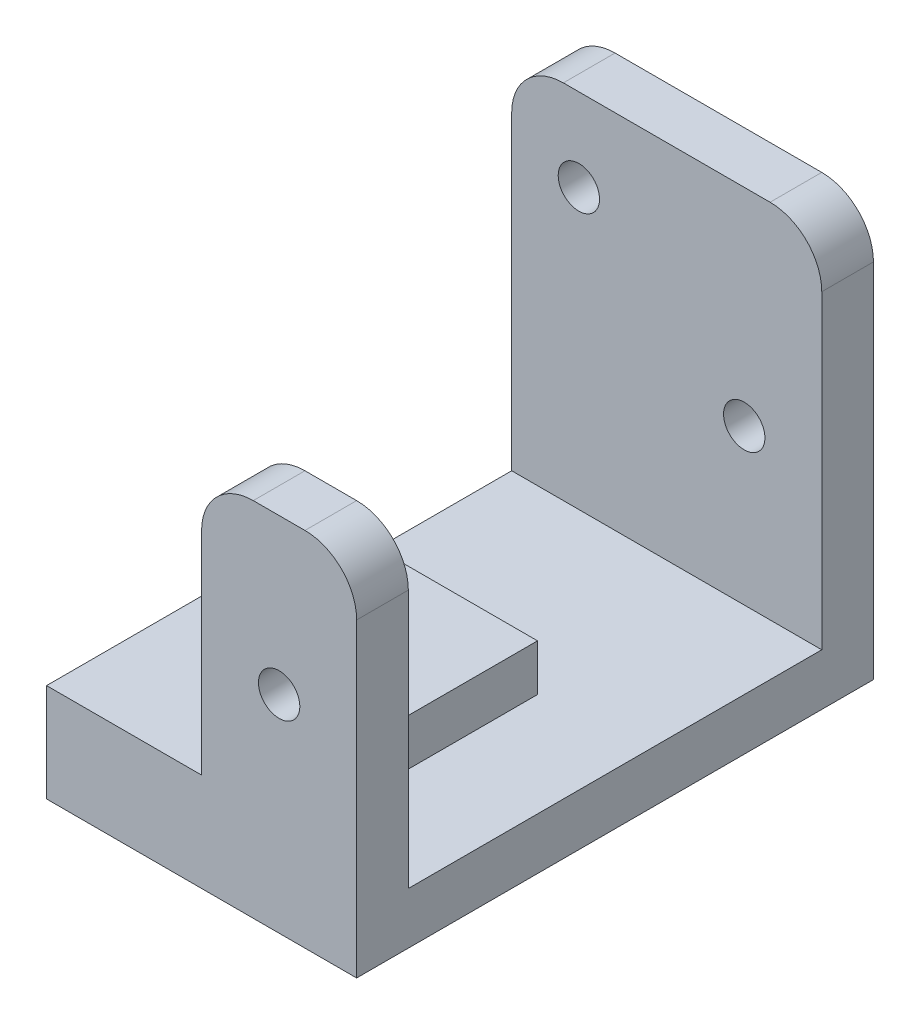
ISO-10303-21;
HEADER;
FILE_DESCRIPTION(('STEP AP214'),'2;1');
FILE_NAME('part.step','',(''),(''),'','','');
FILE_SCHEMA(('AUTOMOTIVE_DESIGN { 1 0 10303 214 1 1 1 1 }'));
ENDSEC;
DATA;
#1=APPLICATION_CONTEXT('core data for automotive mechanical design processes');
#2=APPLICATION_PROTOCOL_DEFINITION('international standard','automotive_design',2000,#1);
#3=PRODUCT_CONTEXT('',#1,'mechanical');
#4=PRODUCT('Part','Part','',(#3));
#5=PRODUCT_RELATED_PRODUCT_CATEGORY('part','',(#4));
#6=PRODUCT_DEFINITION_FORMATION('','',#4);
#7=PRODUCT_DEFINITION_CONTEXT('part definition',#1,'design');
#8=PRODUCT_DEFINITION('design','',#6,#7);
#9=PRODUCT_DEFINITION_SHAPE('','',#8);
#10=(LENGTH_UNIT() NAMED_UNIT(*) SI_UNIT(.MILLI.,.METRE.));
#11=(NAMED_UNIT(*) PLANE_ANGLE_UNIT() SI_UNIT($,.RADIAN.));
#12=(NAMED_UNIT(*) SI_UNIT($,.STERADIAN.) SOLID_ANGLE_UNIT());
#13=UNCERTAINTY_MEASURE_WITH_UNIT(LENGTH_MEASURE(1.E-05),#10,'distance_accuracy_value','');
#14=(GEOMETRIC_REPRESENTATION_CONTEXT(3) GLOBAL_UNCERTAINTY_ASSIGNED_CONTEXT((#13)) GLOBAL_UNIT_ASSIGNED_CONTEXT((#10,
#11,#12)) REPRESENTATION_CONTEXT('',''));
#15=CARTESIAN_POINT('',(0.,0.,0.));
#16=DIRECTION('',(0.,0.,1.));
#17=DIRECTION('',(1.,0.,0.));
#18=AXIS2_PLACEMENT_3D('',#15,#16,#17);
#19=CARTESIAN_POINT('',(0.,10.,0.));
#20=DIRECTION('',(0.,-1.,0.));
#21=DIRECTION('',(0.,0.,-1.));
#22=AXIS2_PLACEMENT_3D('',#19,#20,#21);
#23=PLANE('',#22);
#24=DIRECTION('',(0.,0.,-1.));
#25=VECTOR('',#24,1.);
#26=CARTESIAN_POINT('',(40.,10.,-55.));
#27=LINE('',#26,#25);
#28=CARTESIAN_POINT('',(40.,10.,-10.));
#29=VERTEX_POINT('',#28);
#30=CARTESIAN_POINT('',(40.,10.,-55.));
#31=VERTEX_POINT('',#30);
#32=EDGE_CURVE('E191',#29,#31,#27,.T.);
#33=ORIENTED_EDGE('',*,*,#32,.F.);
#34=DIRECTION('',(-1.,0.,0.));
#35=VECTOR('',#34,1.);
#36=CARTESIAN_POINT('',(30.,10.,-10.));
#37=LINE('',#36,#35);
#38=CARTESIAN_POINT('',(60.,10.,-10.));
#39=VERTEX_POINT('',#38);
#40=EDGE_CURVE('E159',#39,#29,#37,.T.);
#41=ORIENTED_EDGE('',*,*,#40,.F.);
#42=DIRECTION('',(0.,0.,-1.));
#43=VECTOR('',#42,1.);
#44=CARTESIAN_POINT('',(60.,10.,0.));
#45=LINE('',#44,#43);
#46=CARTESIAN_POINT('',(60.,10.,-90.));
#47=VERTEX_POINT('',#46);
#48=EDGE_CURVE('E245',#39,#47,#45,.T.);
#49=ORIENTED_EDGE('',*,*,#48,.T.);
#50=DIRECTION('',(1.,0.,0.));
#51=VECTOR('',#50,1.);
#52=CARTESIAN_POINT('',(60.,10.,-90.));
#53=LINE('',#52,#51);
#54=CARTESIAN_POINT('',(0.,10.,-90.));
#55=VERTEX_POINT('',#54);
#56=EDGE_CURVE('E164',#55,#47,#53,.T.);
#57=ORIENTED_EDGE('',*,*,#56,.F.);
#58=DIRECTION('',(0.,0.,1.));
#59=VECTOR('',#58,1.);
#60=CARTESIAN_POINT('',(0.,10.,0.));
#61=LINE('',#60,#59);
#62=CARTESIAN_POINT('',(0.,10.,-55.));
#63=VERTEX_POINT('',#62);
#64=EDGE_CURVE('E242',#55,#63,#61,.T.);
#65=ORIENTED_EDGE('',*,*,#64,.T.);
#66=DIRECTION('',(-1.,0.,0.));
#67=VECTOR('',#66,1.);
#68=CARTESIAN_POINT('',(0.,10.,-55.));
#69=LINE('',#68,#67);
#70=EDGE_CURVE('E194',#31,#63,#69,.T.);
#71=ORIENTED_EDGE('',*,*,#70,.F.);
#72=EDGE_LOOP('',(#33,#41,#49,#57,#65,#71));
#73=FACE_BOUND('',#72,.T.);
#74=ADVANCED_FACE('F39',(#73),#23,.F.);
#75=CARTESIAN_POINT('',(30.,70.,0.));
#76=DIRECTION('',(1.,0.,0.));
#77=DIRECTION('',(0.,0.,-1.));
#78=AXIS2_PLACEMENT_3D('',#75,#76,#77);
#79=PLANE('',#78);
#80=DIRECTION('',(0.,-1.,0.));
#81=VECTOR('',#80,1.);
#82=CARTESIAN_POINT('',(30.,70.,0.));
#83=LINE('',#82,#81);
#84=CARTESIAN_POINT('',(30.,60.,0.));
#85=VERTEX_POINT('',#84);
#86=CARTESIAN_POINT('',(30.,19.,0.));
#87=VERTEX_POINT('',#86);
#88=EDGE_CURVE('E238',#85,#87,#83,.T.);
#89=ORIENTED_EDGE('',*,*,#88,.F.);
#90=DIRECTION('',(0.,0.,1.));
#91=VECTOR('',#90,1.);
#92=CARTESIAN_POINT('',(30.,60.,0.));
#93=LINE('',#92,#91);
#94=CARTESIAN_POINT('',(30.,60.,-10.));
#95=VERTEX_POINT('',#94);
#96=EDGE_CURVE('E55',#85,#95,#93,.F.);
#97=ORIENTED_EDGE('',*,*,#96,.T.);
#98=DIRECTION('',(0.,-1.,0.));
#99=VECTOR('',#98,1.);
#100=CARTESIAN_POINT('',(30.,70.,-10.));
#101=LINE('',#100,#99);
#102=CARTESIAN_POINT('',(30.,19.,-10.));
#103=VERTEX_POINT('',#102);
#104=EDGE_CURVE('E230',#95,#103,#101,.T.);
#105=ORIENTED_EDGE('',*,*,#104,.T.);
#106=DIRECTION('',(0.,0.,-1.));
#107=VECTOR('',#106,1.);
#108=CARTESIAN_POINT('',(30.,19.,-10.));
#109=LINE('',#108,#107);
#110=EDGE_CURVE('E173',#87,#103,#109,.T.);
#111=ORIENTED_EDGE('',*,*,#110,.F.);
#112=EDGE_LOOP('',(#89,#97,#105,#111));
#113=FACE_BOUND('',#112,.T.);
#114=ADVANCED_FACE('F348',(#113),#79,.F.);
#115=CARTESIAN_POINT('',(30.,70.,-10.));
#116=DIRECTION('',(0.,0.,1.));
#117=DIRECTION('',(1.,0.,0.));
#118=AXIS2_PLACEMENT_3D('',#115,#116,#117);
#119=PLANE('',#118);
#120=CARTESIAN_POINT('',(45.,40.,-10.));
#121=DIRECTION('',(0.,0.,1.));
#122=DIRECTION('',(1.,0.,0.));
#123=AXIS2_PLACEMENT_3D('',#120,#121,#122);
#124=CIRCLE('',#123,4.00000000000001);
#125=CARTESIAN_POINT('',(49.,40.,-10.));
#126=VERTEX_POINT('',#125);
#127=EDGE_CURVE('E195',#126,#126,#124,.T.);
#128=ORIENTED_EDGE('',*,*,#127,.T.);
#129=EDGE_LOOP('',(#128));
#130=FACE_BOUND('',#129,.T.);
#131=ORIENTED_EDGE('',*,*,#104,.F.);
#132=CARTESIAN_POINT('',(40.,60.,-10.));
#133=DIRECTION('',(0.,0.,1.));
#134=DIRECTION('',(1.,0.,0.));
#135=AXIS2_PLACEMENT_3D('',#132,#133,#134);
#136=CIRCLE('',#135,10.);
#137=CARTESIAN_POINT('',(40.,70.,-10.));
#138=VERTEX_POINT('',#137);
#139=EDGE_CURVE('E11',#95,#138,#136,.F.);
#140=ORIENTED_EDGE('',*,*,#139,.T.);
#141=DIRECTION('',(-1.,0.,0.));
#142=VECTOR('',#141,1.);
#143=CARTESIAN_POINT('',(30.,70.,-10.));
#144=LINE('',#143,#142);
#145=CARTESIAN_POINT('',(50.,70.,-10.));
#146=VERTEX_POINT('',#145);
#147=EDGE_CURVE('E226',#146,#138,#144,.T.);
#148=ORIENTED_EDGE('',*,*,#147,.F.);
#149=CARTESIAN_POINT('',(50.,60.,-10.));
#150=DIRECTION('',(0.,0.,1.));
#151=DIRECTION('',(1.,0.,0.));
#152=AXIS2_PLACEMENT_3D('',#149,#150,#151);
#153=CIRCLE('',#152,10.);
#154=CARTESIAN_POINT('',(60.,60.,-10.));
#155=VERTEX_POINT('',#154);
#156=EDGE_CURVE('E48',#146,#155,#153,.F.);
#157=ORIENTED_EDGE('',*,*,#156,.T.);
#158=DIRECTION('',(0.,-1.,0.));
#159=VECTOR('',#158,1.);
#160=CARTESIAN_POINT('',(60.,70.,-10.));
#161=LINE('',#160,#159);
#162=EDGE_CURVE('E235',#155,#39,#161,.T.);
#163=ORIENTED_EDGE('',*,*,#162,.T.);
#164=ORIENTED_EDGE('',*,*,#40,.T.);
#165=DIRECTION('',(0.,-1.,0.));
#166=VECTOR('',#165,1.);
#167=CARTESIAN_POINT('',(40.,19.,-10.));
#168=LINE('',#167,#166);
#169=CARTESIAN_POINT('',(40.,19.,-10.));
#170=VERTEX_POINT('',#169);
#171=EDGE_CURVE('E153',#170,#29,#168,.T.);
#172=ORIENTED_EDGE('',*,*,#171,.F.);
#173=DIRECTION('',(1.,0.,0.));
#174=VECTOR('',#173,1.);
#175=CARTESIAN_POINT('',(40.,19.,-10.));
#176=LINE('',#175,#174);
#177=EDGE_CURVE('E156',#103,#170,#176,.T.);
#178=ORIENTED_EDGE('',*,*,#177,.F.);
#179=EDGE_LOOP('',(#131,#140,#148,#157,#163,#164,#172,#178));
#180=FACE_BOUND('',#179,.T.);
#181=ADVANCED_FACE('F155',(#130,#180),#119,.F.);
#182=CARTESIAN_POINT('',(0.,10.,0.));
#183=DIRECTION('',(1.,0.,0.));
#184=DIRECTION('',(0.,0.,-1.));
#185=AXIS2_PLACEMENT_3D('',#182,#183,#184);
#186=PLANE('',#185);
#187=DIRECTION('',(0.,-1.,0.));
#188=VECTOR('',#187,1.);
#189=CARTESIAN_POINT('',(0.,80.,-90.));
#190=LINE('',#189,#188);
#191=CARTESIAN_POINT('',(0.,70.,-90.));
#192=VERTEX_POINT('',#191);
#193=EDGE_CURVE('E219',#192,#55,#190,.T.);
#194=ORIENTED_EDGE('',*,*,#193,.F.);
#195=DIRECTION('',(0.,0.,1.));
#196=VECTOR('',#195,1.);
#197=CARTESIAN_POINT('',(0.,70.,0.));
#198=LINE('',#197,#196);
#199=CARTESIAN_POINT('',(0.,70.,-100.));
#200=VERTEX_POINT('',#199);
#201=EDGE_CURVE('E300',#192,#200,#198,.F.);
#202=ORIENTED_EDGE('',*,*,#201,.T.);
#203=DIRECTION('',(0.,-1.,0.));
#204=VECTOR('',#203,1.);
#205=CARTESIAN_POINT('',(0.,10.,-100.));
#206=LINE('',#205,#204);
#207=CARTESIAN_POINT('',(0.,0.,-100.));
#208=VERTEX_POINT('',#207);
#209=EDGE_CURVE('E250',#200,#208,#206,.T.);
#210=ORIENTED_EDGE('',*,*,#209,.T.);
#211=DIRECTION('',(0.,0.,1.));
#212=VECTOR('',#211,1.);
#213=CARTESIAN_POINT('',(0.,0.,0.));
#214=LINE('',#213,#212);
#215=CARTESIAN_POINT('',(0.,0.,0.));
#216=VERTEX_POINT('',#215);
#217=EDGE_CURVE('E241',#208,#216,#214,.T.);
#218=ORIENTED_EDGE('',*,*,#217,.T.);
#219=DIRECTION('',(0.,-1.,0.));
#220=VECTOR('',#219,1.);
#221=CARTESIAN_POINT('',(0.,10.,0.));
#222=LINE('',#221,#220);
#223=CARTESIAN_POINT('',(0.,19.,0.));
#224=VERTEX_POINT('',#223);
#225=EDGE_CURVE('E273',#224,#216,#222,.T.);
#226=ORIENTED_EDGE('',*,*,#225,.F.);
#227=DIRECTION('',(0.,0.,1.));
#228=VECTOR('',#227,1.);
#229=CARTESIAN_POINT('',(0.,19.,0.));
#230=LINE('',#229,#228);
#231=CARTESIAN_POINT('',(0.,19.,-55.));
#232=VERTEX_POINT('',#231);
#233=EDGE_CURVE('E183',#232,#224,#230,.T.);
#234=ORIENTED_EDGE('',*,*,#233,.F.);
#235=DIRECTION('',(0.,-1.,0.));
#236=VECTOR('',#235,1.);
#237=CARTESIAN_POINT('',(0.,19.,-55.));
#238=LINE('',#237,#236);
#239=EDGE_CURVE('E190',#232,#63,#238,.T.);
#240=ORIENTED_EDGE('',*,*,#239,.T.);
#241=ORIENTED_EDGE('',*,*,#64,.F.);
#242=EDGE_LOOP('',(#194,#202,#210,#218,#226,#234,#240,#241));
#243=FACE_BOUND('',#242,.T.);
#244=ADVANCED_FACE('F380',(#243),#186,.F.);
#245=CARTESIAN_POINT('',(0.,10.,0.));
#246=DIRECTION('',(0.,0.,-1.));
#247=DIRECTION('',(-1.,0.,0.));
#248=AXIS2_PLACEMENT_3D('',#245,#246,#247);
#249=PLANE('',#248);
#250=CARTESIAN_POINT('',(45.,40.,0.));
#251=DIRECTION('',(0.,0.,-1.));
#252=DIRECTION('',(-1.,0.,0.));
#253=AXIS2_PLACEMENT_3D('',#250,#251,#252);
#254=CIRCLE('',#253,4.00000000000001);
#255=CARTESIAN_POINT('',(41.,40.,0.));
#256=VERTEX_POINT('',#255);
#257=EDGE_CURVE('E283',#256,#256,#254,.T.);
#258=ORIENTED_EDGE('',*,*,#257,.T.);
#259=EDGE_LOOP('',(#258));
#260=FACE_BOUND('',#259,.T.);
#261=DIRECTION('',(1.,0.,0.));
#262=VECTOR('',#261,1.);
#263=CARTESIAN_POINT('',(30.,70.,0.));
#264=LINE('',#263,#262);
#265=CARTESIAN_POINT('',(40.,70.,0.));
#266=VERTEX_POINT('',#265);
#267=CARTESIAN_POINT('',(50.,70.,0.));
#268=VERTEX_POINT('',#267);
#269=EDGE_CURVE('E222',#266,#268,#264,.T.);
#270=ORIENTED_EDGE('',*,*,#269,.F.);
#271=CARTESIAN_POINT('',(40.,60.,0.));
#272=DIRECTION('',(0.,0.,-1.));
#273=DIRECTION('',(-1.,0.,0.));
#274=AXIS2_PLACEMENT_3D('',#271,#272,#273);
#275=CIRCLE('',#274,10.);
#276=EDGE_CURVE('E63',#266,#85,#275,.F.);
#277=ORIENTED_EDGE('',*,*,#276,.T.);
#278=ORIENTED_EDGE('',*,*,#88,.T.);
#279=DIRECTION('',(1.,0.,0.));
#280=VECTOR('',#279,1.);
#281=CARTESIAN_POINT('',(30.,19.,0.));
#282=LINE('',#281,#280);
#283=EDGE_CURVE('E199',#224,#87,#282,.T.);
#284=ORIENTED_EDGE('',*,*,#283,.F.);
#285=ORIENTED_EDGE('',*,*,#225,.T.);
#286=DIRECTION('',(1.,0.,0.));
#287=VECTOR('',#286,1.);
#288=CARTESIAN_POINT('',(0.,0.,0.));
#289=LINE('',#288,#287);
#290=CARTESIAN_POINT('',(60.,0.,0.));
#291=VERTEX_POINT('',#290);
#292=EDGE_CURVE('E254',#216,#291,#289,.T.);
#293=ORIENTED_EDGE('',*,*,#292,.T.);
#294=DIRECTION('',(0.,-1.,0.));
#295=VECTOR('',#294,1.);
#296=CARTESIAN_POINT('',(60.,10.,0.));
#297=LINE('',#296,#295);
#298=CARTESIAN_POINT('',(60.,60.,0.));
#299=VERTEX_POINT('',#298);
#300=EDGE_CURVE('E270',#299,#291,#297,.T.);
#301=ORIENTED_EDGE('',*,*,#300,.F.);
#302=CARTESIAN_POINT('',(50.,60.,0.));
#303=DIRECTION('',(0.,0.,-1.));
#304=DIRECTION('',(-1.,0.,0.));
#305=AXIS2_PLACEMENT_3D('',#302,#303,#304);
#306=CIRCLE('',#305,10.);
#307=EDGE_CURVE('E323',#299,#268,#306,.F.);
#308=ORIENTED_EDGE('',*,*,#307,.T.);
#309=EDGE_LOOP('',(#270,#277,#278,#284,#285,#293,#301,#308));
#310=FACE_BOUND('',#309,.T.);
#311=ADVANCED_FACE('F341',(#260,#310),#249,.F.);
#312=CARTESIAN_POINT('',(60.,10.,0.));
#313=DIRECTION('',(-1.,0.,0.));
#314=DIRECTION('',(0.,0.,1.));
#315=AXIS2_PLACEMENT_3D('',#312,#313,#314);
#316=PLANE('',#315);
#317=DIRECTION('',(0.,-1.,0.));
#318=VECTOR('',#317,1.);
#319=CARTESIAN_POINT('',(60.,10.,-100.));
#320=LINE('',#319,#318);
#321=CARTESIAN_POINT('',(60.,70.,-100.));
#322=VERTEX_POINT('',#321);
#323=CARTESIAN_POINT('',(60.,0.,-100.));
#324=VERTEX_POINT('',#323);
#325=EDGE_CURVE('E267',#322,#324,#320,.T.);
#326=ORIENTED_EDGE('',*,*,#325,.F.);
#327=DIRECTION('',(0.,0.,-1.));
#328=VECTOR('',#327,1.);
#329=CARTESIAN_POINT('',(60.,70.,0.));
#330=LINE('',#329,#328);
#331=CARTESIAN_POINT('',(60.,70.,-90.));
#332=VERTEX_POINT('',#331);
#333=EDGE_CURVE('E312',#322,#332,#330,.F.);
#334=ORIENTED_EDGE('',*,*,#333,.T.);
#335=DIRECTION('',(0.,-1.,0.));
#336=VECTOR('',#335,1.);
#337=CARTESIAN_POINT('',(60.,80.,-90.));
#338=LINE('',#337,#336);
#339=EDGE_CURVE('E213',#332,#47,#338,.T.);
#340=ORIENTED_EDGE('',*,*,#339,.T.);
#341=ORIENTED_EDGE('',*,*,#48,.F.);
#342=ORIENTED_EDGE('',*,*,#162,.F.);
#343=DIRECTION('',(0.,0.,-1.));
#344=VECTOR('',#343,1.);
#345=CARTESIAN_POINT('',(60.,60.,0.));
#346=LINE('',#345,#344);
#347=EDGE_CURVE('E309',#155,#299,#346,.F.);
#348=ORIENTED_EDGE('',*,*,#347,.T.);
#349=ORIENTED_EDGE('',*,*,#300,.T.);
#350=DIRECTION('',(0.,0.,-1.));
#351=VECTOR('',#350,1.);
#352=CARTESIAN_POINT('',(60.,0.,0.));
#353=LINE('',#352,#351);
#354=EDGE_CURVE('E258',#291,#324,#353,.T.);
#355=ORIENTED_EDGE('',*,*,#354,.T.);
#356=EDGE_LOOP('',(#326,#334,#340,#341,#342,#348,#349,#355));
#357=FACE_BOUND('',#356,.T.);
#358=ADVANCED_FACE('F338',(#357),#316,.F.);
#359=CARTESIAN_POINT('',(0.,10.,-100.));
#360=DIRECTION('',(0.,0.,1.));
#361=DIRECTION('',(1.,0.,0.));
#362=AXIS2_PLACEMENT_3D('',#359,#360,#361);
#363=PLANE('',#362);
#364=CARTESIAN_POINT('',(45.,40.,-100.));
#365=DIRECTION('',(0.,0.,-1.));
#366=DIRECTION('',(-1.,0.,0.));
#367=AXIS2_PLACEMENT_3D('',#364,#365,#366);
#368=CIRCLE('',#367,4.00000000000001);
#369=CARTESIAN_POINT('',(41.,40.,-100.));
#370=VERTEX_POINT('',#369);
#371=EDGE_CURVE('E362',#370,#370,#368,.T.);
#372=ORIENTED_EDGE('',*,*,#371,.F.);
#373=EDGE_LOOP('',(#372));
#374=FACE_BOUND('',#373,.T.);
#375=CARTESIAN_POINT('',(13.,64.,-100.));
#376=DIRECTION('',(0.,0.,-1.));
#377=DIRECTION('',(-1.,0.,0.));
#378=AXIS2_PLACEMENT_3D('',#375,#376,#377);
#379=CIRCLE('',#378,4.00000000000001);
#380=CARTESIAN_POINT('',(8.99999999999998,64.,-100.));
#381=VERTEX_POINT('',#380);
#382=EDGE_CURVE('E358',#381,#381,#379,.T.);
#383=ORIENTED_EDGE('',*,*,#382,.F.);
#384=EDGE_LOOP('',(#383));
#385=FACE_BOUND('',#384,.T.);
#386=ORIENTED_EDGE('',*,*,#209,.F.);
#387=CARTESIAN_POINT('',(10.,70.,-100.));
#388=DIRECTION('',(0.,0.,1.));
#389=DIRECTION('',(1.,0.,0.));
#390=AXIS2_PLACEMENT_3D('',#387,#388,#389);
#391=CIRCLE('',#390,10.);
#392=CARTESIAN_POINT('',(10.,80.,-100.));
#393=VERTEX_POINT('',#392);
#394=EDGE_CURVE('E306',#200,#393,#391,.F.);
#395=ORIENTED_EDGE('',*,*,#394,.T.);
#396=DIRECTION('',(-1.,0.,0.));
#397=VECTOR('',#396,1.);
#398=CARTESIAN_POINT('',(60.,80.,-100.));
#399=LINE('',#398,#397);
#400=CARTESIAN_POINT('',(50.,80.,-100.));
#401=VERTEX_POINT('',#400);
#402=EDGE_CURVE('E209',#401,#393,#399,.T.);
#403=ORIENTED_EDGE('',*,*,#402,.F.);
#404=CARTESIAN_POINT('',(50.,70.,-100.));
#405=DIRECTION('',(0.,0.,1.));
#406=DIRECTION('',(1.,0.,0.));
#407=AXIS2_PLACEMENT_3D('',#404,#405,#406);
#408=CIRCLE('',#407,10.);
#409=EDGE_CURVE('E303',#401,#322,#408,.F.);
#410=ORIENTED_EDGE('',*,*,#409,.T.);
#411=ORIENTED_EDGE('',*,*,#325,.T.);
#412=DIRECTION('',(-1.,0.,0.));
#413=VECTOR('',#412,1.);
#414=CARTESIAN_POINT('',(0.,0.,-100.));
#415=LINE('',#414,#413);
#416=EDGE_CURVE('E246',#324,#208,#415,.T.);
#417=ORIENTED_EDGE('',*,*,#416,.T.);
#418=EDGE_LOOP('',(#386,#395,#403,#410,#411,#417));
#419=FACE_BOUND('',#418,.T.);
#420=ADVANCED_FACE('F399',(#374,#385,#419),#363,.F.);
#421=CARTESIAN_POINT('',(0.,0.,0.));
#422=DIRECTION('',(0.,-1.,0.));
#423=DIRECTION('',(0.,0.,-1.));
#424=AXIS2_PLACEMENT_3D('',#421,#422,#423);
#425=PLANE('',#424);
#426=ORIENTED_EDGE('',*,*,#217,.F.);
#427=ORIENTED_EDGE('',*,*,#416,.F.);
#428=ORIENTED_EDGE('',*,*,#354,.F.);
#429=ORIENTED_EDGE('',*,*,#292,.F.);
#430=EDGE_LOOP('',(#426,#427,#428,#429));
#431=FACE_BOUND('',#430,.T.);
#432=ADVANCED_FACE('F396',(#431),#425,.T.);
#433=CARTESIAN_POINT('',(0.,70.,0.));
#434=DIRECTION('',(0.,-1.,0.));
#435=DIRECTION('',(0.,0.,-1.));
#436=AXIS2_PLACEMENT_3D('',#433,#434,#435);
#437=PLANE('',#436);
#438=ORIENTED_EDGE('',*,*,#147,.T.);
#439=DIRECTION('',(0.,0.,1.));
#440=VECTOR('',#439,1.);
#441=CARTESIAN_POINT('',(40.,70.,0.));
#442=LINE('',#441,#440);
#443=EDGE_CURVE('E319',#138,#266,#442,.T.);
#444=ORIENTED_EDGE('',*,*,#443,.T.);
#445=ORIENTED_EDGE('',*,*,#269,.T.);
#446=DIRECTION('',(0.,0.,-1.));
#447=VECTOR('',#446,1.);
#448=CARTESIAN_POINT('',(50.,70.,0.));
#449=LINE('',#448,#447);
#450=EDGE_CURVE('E315',#268,#146,#449,.T.);
#451=ORIENTED_EDGE('',*,*,#450,.T.);
#452=EDGE_LOOP('',(#438,#444,#445,#451));
#453=FACE_BOUND('',#452,.T.);
#454=ADVANCED_FACE('F343',(#453),#437,.F.);
#455=CARTESIAN_POINT('',(60.,80.,-90.));
#456=DIRECTION('',(0.,0.,-1.));
#457=DIRECTION('',(-1.,0.,0.));
#458=AXIS2_PLACEMENT_3D('',#455,#456,#457);
#459=PLANE('',#458);
#460=CARTESIAN_POINT('',(45.,40.,-90.));
#461=DIRECTION('',(0.,0.,-1.));
#462=DIRECTION('',(-1.,0.,0.));
#463=AXIS2_PLACEMENT_3D('',#460,#461,#462);
#464=CIRCLE('',#463,4.00000000000001);
#465=CARTESIAN_POINT('',(41.,40.,-90.));
#466=VERTEX_POINT('',#465);
#467=EDGE_CURVE('E282',#466,#466,#464,.T.);
#468=ORIENTED_EDGE('',*,*,#467,.T.);
#469=EDGE_LOOP('',(#468));
#470=FACE_BOUND('',#469,.T.);
#471=CARTESIAN_POINT('',(13.,64.,-90.));
#472=DIRECTION('',(0.,0.,-1.));
#473=DIRECTION('',(-1.,0.,0.));
#474=AXIS2_PLACEMENT_3D('',#471,#472,#473);
#475=CIRCLE('',#474,4.00000000000001);
#476=CARTESIAN_POINT('',(8.99999999999998,64.,-90.));
#477=VERTEX_POINT('',#476);
#478=EDGE_CURVE('E278',#477,#477,#475,.T.);
#479=ORIENTED_EDGE('',*,*,#478,.T.);
#480=EDGE_LOOP('',(#479));
#481=FACE_BOUND('',#480,.T.);
#482=DIRECTION('',(1.,0.,0.));
#483=VECTOR('',#482,1.);
#484=CARTESIAN_POINT('',(60.,80.,-90.));
#485=LINE('',#484,#483);
#486=CARTESIAN_POINT('',(10.,80.,-90.));
#487=VERTEX_POINT('',#486);
#488=CARTESIAN_POINT('',(50.,80.,-90.));
#489=VERTEX_POINT('',#488);
#490=EDGE_CURVE('E205',#487,#489,#485,.T.);
#491=ORIENTED_EDGE('',*,*,#490,.F.);
#492=CARTESIAN_POINT('',(10.,70.,-90.));
#493=DIRECTION('',(0.,0.,-1.));
#494=DIRECTION('',(-1.,0.,0.));
#495=AXIS2_PLACEMENT_3D('',#492,#493,#494);
#496=CIRCLE('',#495,10.);
#497=EDGE_CURVE('E297',#487,#192,#496,.F.);
#498=ORIENTED_EDGE('',*,*,#497,.T.);
#499=ORIENTED_EDGE('',*,*,#193,.T.);
#500=ORIENTED_EDGE('',*,*,#56,.T.);
#501=ORIENTED_EDGE('',*,*,#339,.F.);
#502=CARTESIAN_POINT('',(50.,70.,-90.));
#503=DIRECTION('',(0.,0.,-1.));
#504=DIRECTION('',(-1.,0.,0.));
#505=AXIS2_PLACEMENT_3D('',#502,#503,#504);
#506=CIRCLE('',#505,10.);
#507=EDGE_CURVE('E294',#332,#489,#506,.F.);
#508=ORIENTED_EDGE('',*,*,#507,.T.);
#509=EDGE_LOOP('',(#491,#498,#499,#500,#501,#508));
#510=FACE_BOUND('',#509,.T.);
#511=ADVANCED_FACE('F447',(#470,#481,#510),#459,.F.);
#512=CARTESIAN_POINT('',(0.,80.,0.));
#513=DIRECTION('',(0.,-1.,0.));
#514=DIRECTION('',(0.,0.,-1.));
#515=AXIS2_PLACEMENT_3D('',#512,#513,#514);
#516=PLANE('',#515);
#517=ORIENTED_EDGE('',*,*,#402,.T.);
#518=DIRECTION('',(0.,0.,1.));
#519=VECTOR('',#518,1.);
#520=CARTESIAN_POINT('',(10.,80.,0.));
#521=LINE('',#520,#519);
#522=EDGE_CURVE('E290',#393,#487,#521,.T.);
#523=ORIENTED_EDGE('',*,*,#522,.T.);
#524=ORIENTED_EDGE('',*,*,#490,.T.);
#525=DIRECTION('',(0.,0.,-1.));
#526=VECTOR('',#525,1.);
#527=CARTESIAN_POINT('',(50.,80.,0.));
#528=LINE('',#527,#526);
#529=EDGE_CURVE('E277',#489,#401,#528,.T.);
#530=ORIENTED_EDGE('',*,*,#529,.T.);
#531=EDGE_LOOP('',(#517,#523,#524,#530));
#532=FACE_BOUND('',#531,.T.);
#533=ADVANCED_FACE('F442',(#532),#516,.F.);
#534=CARTESIAN_POINT('',(40.,19.,-55.));
#535=DIRECTION('',(-1.,0.,0.));
#536=DIRECTION('',(0.,0.,1.));
#537=AXIS2_PLACEMENT_3D('',#534,#535,#536);
#538=PLANE('',#537);
#539=ORIENTED_EDGE('',*,*,#32,.T.);
#540=DIRECTION('',(0.,-1.,0.));
#541=VECTOR('',#540,1.);
#542=CARTESIAN_POINT('',(40.,19.,-55.));
#543=LINE('',#542,#541);
#544=CARTESIAN_POINT('',(40.,19.,-55.));
#545=VERTEX_POINT('',#544);
#546=EDGE_CURVE('E165',#545,#31,#543,.T.);
#547=ORIENTED_EDGE('',*,*,#546,.F.);
#548=DIRECTION('',(0.,0.,-1.));
#549=VECTOR('',#548,1.);
#550=CARTESIAN_POINT('',(40.,19.,-55.));
#551=LINE('',#550,#549);
#552=EDGE_CURVE('E170',#170,#545,#551,.T.);
#553=ORIENTED_EDGE('',*,*,#552,.F.);
#554=ORIENTED_EDGE('',*,*,#171,.T.);
#555=EDGE_LOOP('',(#539,#547,#553,#554));
#556=FACE_BOUND('',#555,.T.);
#557=ADVANCED_FACE('F176',(#556),#538,.F.);
#558=CARTESIAN_POINT('',(0.,19.,-55.));
#559=DIRECTION('',(0.,0.,1.));
#560=DIRECTION('',(1.,0.,0.));
#561=AXIS2_PLACEMENT_3D('',#558,#559,#560);
#562=PLANE('',#561);
#563=ORIENTED_EDGE('',*,*,#70,.T.);
#564=ORIENTED_EDGE('',*,*,#239,.F.);
#565=DIRECTION('',(-1.,0.,0.));
#566=VECTOR('',#565,1.);
#567=CARTESIAN_POINT('',(0.,19.,-55.));
#568=LINE('',#567,#566);
#569=EDGE_CURVE('E180',#545,#232,#568,.T.);
#570=ORIENTED_EDGE('',*,*,#569,.F.);
#571=ORIENTED_EDGE('',*,*,#546,.T.);
#572=EDGE_LOOP('',(#563,#564,#570,#571));
#573=FACE_BOUND('',#572,.T.);
#574=ADVANCED_FACE('F537',(#573),#562,.F.);
#575=CARTESIAN_POINT('',(0.,19.,0.));
#576=DIRECTION('',(0.,-1.,0.));
#577=DIRECTION('',(0.,0.,-1.));
#578=AXIS2_PLACEMENT_3D('',#575,#576,#577);
#579=PLANE('',#578);
#580=ORIENTED_EDGE('',*,*,#283,.T.);
#581=ORIENTED_EDGE('',*,*,#110,.T.);
#582=ORIENTED_EDGE('',*,*,#177,.T.);
#583=ORIENTED_EDGE('',*,*,#552,.T.);
#584=ORIENTED_EDGE('',*,*,#569,.T.);
#585=ORIENTED_EDGE('',*,*,#233,.T.);
#586=EDGE_LOOP('',(#580,#581,#582,#583,#584,#585));
#587=FACE_BOUND('',#586,.T.);
#588=ADVANCED_FACE('F169',(#587),#579,.F.);
#589=CARTESIAN_POINT('',(13.,64.,0.));
#590=DIRECTION('',(0.,0.,-1.));
#591=DIRECTION('',(-1.,0.,0.));
#592=AXIS2_PLACEMENT_3D('',#589,#590,#591);
#593=CYLINDRICAL_SURFACE('',#592,4.00000000000001);
#594=ORIENTED_EDGE('',*,*,#382,.T.);
#595=EDGE_LOOP('',(#594));
#596=FACE_BOUND('',#595,.T.);
#597=ORIENTED_EDGE('',*,*,#478,.F.);
#598=EDGE_LOOP('',(#597));
#599=FACE_BOUND('',#598,.T.);
#600=ADVANCED_FACE('F519',(#596,#599),#593,.F.);
#601=CARTESIAN_POINT('',(45.,40.,0.));
#602=DIRECTION('',(0.,0.,-1.));
#603=DIRECTION('',(-1.,0.,0.));
#604=AXIS2_PLACEMENT_3D('',#601,#602,#603);
#605=CYLINDRICAL_SURFACE('',#604,4.00000000000001);
#606=ORIENTED_EDGE('',*,*,#371,.T.);
#607=EDGE_LOOP('',(#606));
#608=FACE_BOUND('',#607,.T.);
#609=ORIENTED_EDGE('',*,*,#467,.F.);
#610=EDGE_LOOP('',(#609));
#611=FACE_BOUND('',#610,.T.);
#612=ADVANCED_FACE('F375',(#608,#611),#605,.F.);
#613=ORIENTED_EDGE('',*,*,#257,.F.);
#614=EDGE_LOOP('',(#613));
#615=FACE_BOUND('',#614,.T.);
#616=ORIENTED_EDGE('',*,*,#127,.F.);
#617=EDGE_LOOP('',(#616));
#618=FACE_BOUND('',#617,.T.);
#619=ADVANCED_FACE('F371',(#615,#618),#605,.F.);
#620=CARTESIAN_POINT('',(10.,70.,0.));
#621=DIRECTION('',(0.,0.,1.));
#622=DIRECTION('',(1.,0.,0.));
#623=AXIS2_PLACEMENT_3D('',#620,#621,#622);
#624=CYLINDRICAL_SURFACE('',#623,10.);
#625=ORIENTED_EDGE('',*,*,#394,.F.);
#626=ORIENTED_EDGE('',*,*,#201,.F.);
#627=ORIENTED_EDGE('',*,*,#497,.F.);
#628=ORIENTED_EDGE('',*,*,#522,.F.);
#629=EDGE_LOOP('',(#625,#626,#627,#628));
#630=FACE_BOUND('',#629,.T.);
#631=ADVANCED_FACE('F374',(#630),#624,.T.);
#632=CARTESIAN_POINT('',(50.,70.,0.));
#633=DIRECTION('',(0.,0.,-1.));
#634=DIRECTION('',(-1.,0.,0.));
#635=AXIS2_PLACEMENT_3D('',#632,#633,#634);
#636=CYLINDRICAL_SURFACE('',#635,10.);
#637=ORIENTED_EDGE('',*,*,#507,.F.);
#638=ORIENTED_EDGE('',*,*,#333,.F.);
#639=ORIENTED_EDGE('',*,*,#409,.F.);
#640=ORIENTED_EDGE('',*,*,#529,.F.);
#641=EDGE_LOOP('',(#637,#638,#639,#640));
#642=FACE_BOUND('',#641,.T.);
#643=ADVANCED_FACE('F410',(#642),#636,.T.);
#644=CARTESIAN_POINT('',(40.,60.,0.));
#645=DIRECTION('',(0.,0.,1.));
#646=DIRECTION('',(1.,0.,0.));
#647=AXIS2_PLACEMENT_3D('',#644,#645,#646);
#648=CYLINDRICAL_SURFACE('',#647,10.);
#649=ORIENTED_EDGE('',*,*,#139,.F.);
#650=ORIENTED_EDGE('',*,*,#96,.F.);
#651=ORIENTED_EDGE('',*,*,#276,.F.);
#652=ORIENTED_EDGE('',*,*,#443,.F.);
#653=EDGE_LOOP('',(#649,#650,#651,#652));
#654=FACE_BOUND('',#653,.T.);
#655=ADVANCED_FACE('F347',(#654),#648,.T.);
#656=CARTESIAN_POINT('',(50.,60.,0.));
#657=DIRECTION('',(0.,0.,-1.));
#658=DIRECTION('',(-1.,0.,0.));
#659=AXIS2_PLACEMENT_3D('',#656,#657,#658);
#660=CYLINDRICAL_SURFACE('',#659,10.);
#661=ORIENTED_EDGE('',*,*,#307,.F.);
#662=ORIENTED_EDGE('',*,*,#347,.F.);
#663=ORIENTED_EDGE('',*,*,#156,.F.);
#664=ORIENTED_EDGE('',*,*,#450,.F.);
#665=EDGE_LOOP('',(#661,#662,#663,#664));
#666=FACE_BOUND('',#665,.T.);
#667=ADVANCED_FACE('F41',(#666),#660,.T.);
#668=CLOSED_SHELL('',(#74,#114,#181,#244,#311,#358,#420,#432,#454,#511,#533,#557,#574,#588,#600,
#612,#619,#631,#643,#655,#667));
#669=MANIFOLD_SOLID_BREP('B2',#668);
#670=ADVANCED_BREP_SHAPE_REPRESENTATION('',(#18,#669),#14);
#671=SHAPE_DEFINITION_REPRESENTATION(#9,#670);
ENDSEC;
END-ISO-10303-21;
